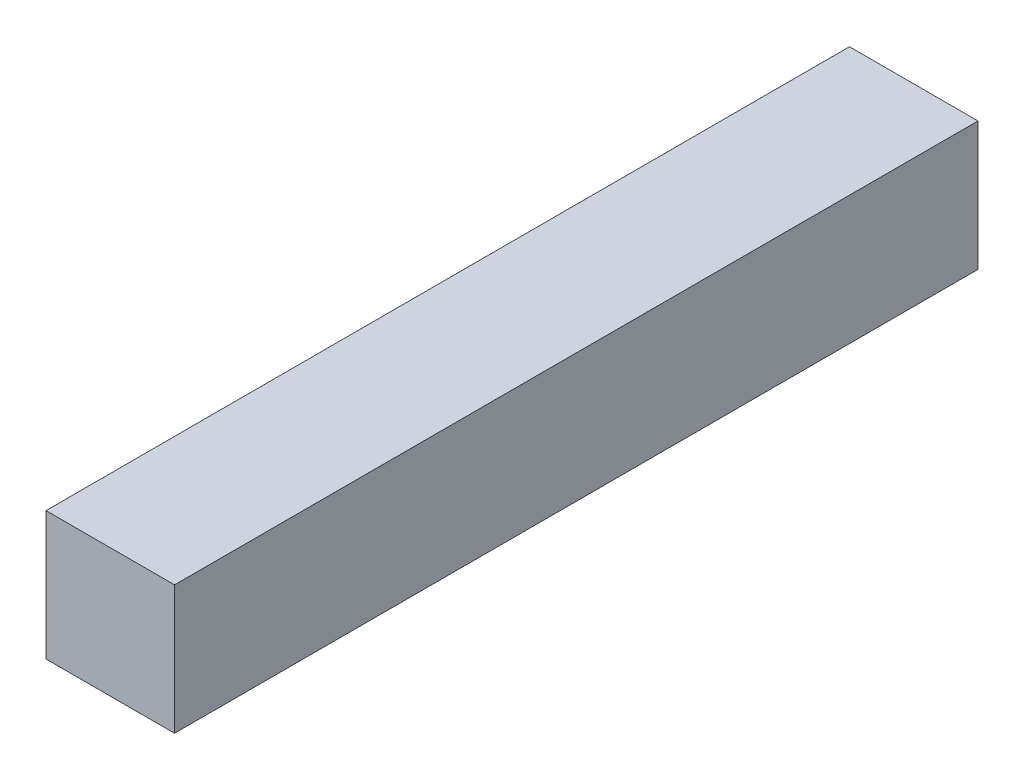
ISO-10303-21;
HEADER;
FILE_DESCRIPTION(('STEP AP214'),'2;1');
FILE_NAME('part.step','',(''),(''),'','','');
FILE_SCHEMA(('AUTOMOTIVE_DESIGN { 1 0 10303 214 1 1 1 1 }'));
ENDSEC;
DATA;
#1=APPLICATION_CONTEXT('core data for automotive mechanical design processes');
#2=APPLICATION_PROTOCOL_DEFINITION('international standard','automotive_design',2000,#1);
#3=PRODUCT_CONTEXT('',#1,'mechanical');
#4=PRODUCT('Part','Part','',(#3));
#5=PRODUCT_RELATED_PRODUCT_CATEGORY('part','',(#4));
#6=PRODUCT_DEFINITION_FORMATION('','',#4);
#7=PRODUCT_DEFINITION_CONTEXT('part definition',#1,'design');
#8=PRODUCT_DEFINITION('design','',#6,#7);
#9=PRODUCT_DEFINITION_SHAPE('','',#8);
#10=(LENGTH_UNIT() NAMED_UNIT(*) SI_UNIT(.MILLI.,.METRE.));
#11=(NAMED_UNIT(*) PLANE_ANGLE_UNIT() SI_UNIT($,.RADIAN.));
#12=(NAMED_UNIT(*) SI_UNIT($,.STERADIAN.) SOLID_ANGLE_UNIT());
#13=UNCERTAINTY_MEASURE_WITH_UNIT(LENGTH_MEASURE(1.E-05),#10,'distance_accuracy_value','');
#14=(GEOMETRIC_REPRESENTATION_CONTEXT(3) GLOBAL_UNCERTAINTY_ASSIGNED_CONTEXT((#13)) GLOBAL_UNIT_ASSIGNED_CONTEXT((#10,
#11,#12)) REPRESENTATION_CONTEXT('',''));
#15=CARTESIAN_POINT('',(0.,0.,0.));
#16=DIRECTION('',(0.,0.,1.));
#17=DIRECTION('',(1.,0.,0.));
#18=AXIS2_PLACEMENT_3D('',#15,#16,#17);
#19=CARTESIAN_POINT('',(-3.00120043547071,1.17046821977065,0.));
#20=DIRECTION('',(0.,1.,0.));
#21=DIRECTION('',(0.,0.,1.));
#22=AXIS2_PLACEMENT_3D('',#19,#20,#21);
#23=PLANE('',#22);
#24=DIRECTION('',(1.,0.,0.));
#25=VECTOR('',#24,1.);
#26=CARTESIAN_POINT('',(-2.7012004354707,1.17046821977065,0.));
#27=LINE('',#26,#25);
#28=CARTESIAN_POINT('',(-2.40120043547071,1.17046821977065,0.));
#29=VERTEX_POINT('',#28);
#30=CARTESIAN_POINT('',(-3.00120043547071,1.17046821977065,0.));
#31=VERTEX_POINT('',#30);
#32=EDGE_CURVE('E68',#29,#31,#27,.F.);
#33=ORIENTED_EDGE('',*,*,#32,.T.);
#34=DIRECTION('',(0.,0.,1.));
#35=VECTOR('',#34,1.);
#36=CARTESIAN_POINT('',(-3.00120043547071,1.17046821977065,0.));
#37=LINE('',#36,#35);
#38=CARTESIAN_POINT('',(-3.00120043547071,1.17046821977065,3.75));
#39=VERTEX_POINT('',#38);
#40=EDGE_CURVE('E55',#39,#31,#37,.F.);
#41=ORIENTED_EDGE('',*,*,#40,.F.);
#42=DIRECTION('',(1.,0.,0.));
#43=VECTOR('',#42,1.);
#44=CARTESIAN_POINT('',(-2.7012004354707,1.17046821977065,3.75));
#45=LINE('',#44,#43);
#46=CARTESIAN_POINT('',(-2.40120043547071,1.17046821977065,3.75));
#47=VERTEX_POINT('',#46);
#48=EDGE_CURVE('E20',#47,#39,#45,.F.);
#49=ORIENTED_EDGE('',*,*,#48,.F.);
#50=DIRECTION('',(0.,0.,-1.));
#51=VECTOR('',#50,1.);
#52=CARTESIAN_POINT('',(-2.40120043547071,1.17046821977065,0.));
#53=LINE('',#52,#51);
#54=EDGE_CURVE('E81',#29,#47,#53,.F.);
#55=ORIENTED_EDGE('',*,*,#54,.F.);
#56=EDGE_LOOP('',(#33,#41,#49,#55));
#57=FACE_BOUND('',#56,.T.);
#58=ADVANCED_FACE('F17',(#57),#23,.T.);
#59=CARTESIAN_POINT('',(-2.7012004354707,0.870468219770652,3.75));
#60=DIRECTION('',(0.,0.,1.));
#61=DIRECTION('',(1.,0.,0.));
#62=AXIS2_PLACEMENT_3D('',#59,#60,#61);
#63=PLANE('',#62);
#64=DIRECTION('',(0.,1.,0.));
#65=VECTOR('',#64,1.);
#66=CARTESIAN_POINT('',(-3.00120043547071,0.570468219770652,3.75));
#67=LINE('',#66,#65);
#68=CARTESIAN_POINT('',(-3.00120043547071,0.570468219770652,3.75));
#69=VERTEX_POINT('',#68);
#70=EDGE_CURVE('E61',#69,#39,#67,.T.);
#71=ORIENTED_EDGE('',*,*,#70,.F.);
#72=DIRECTION('',(1.,0.,0.));
#73=VECTOR('',#72,1.);
#74=CARTESIAN_POINT('',(-2.40120043547071,0.570468219770652,3.75));
#75=LINE('',#74,#73);
#76=CARTESIAN_POINT('',(-2.40120043547071,0.570468219770652,3.75));
#77=VERTEX_POINT('',#76);
#78=EDGE_CURVE('E83',#77,#69,#75,.F.);
#79=ORIENTED_EDGE('',*,*,#78,.F.);
#80=DIRECTION('',(0.,1.,0.));
#81=VECTOR('',#80,1.);
#82=CARTESIAN_POINT('',(-2.40120043547071,1.17046821977065,3.75));
#83=LINE('',#82,#81);
#84=EDGE_CURVE('E64',#47,#77,#83,.F.);
#85=ORIENTED_EDGE('',*,*,#84,.F.);
#86=ORIENTED_EDGE('',*,*,#48,.T.);
#87=EDGE_LOOP('',(#71,#79,#85,#86));
#88=FACE_BOUND('',#87,.T.);
#89=ADVANCED_FACE('F60',(#88),#63,.T.);
#90=CARTESIAN_POINT('',(-3.00120043547071,0.570468219770652,0.));
#91=DIRECTION('',(-1.,0.,0.));
#92=DIRECTION('',(0.,0.,1.));
#93=AXIS2_PLACEMENT_3D('',#90,#91,#92);
#94=PLANE('',#93);
#95=DIRECTION('',(0.,1.,0.));
#96=VECTOR('',#95,1.);
#97=CARTESIAN_POINT('',(-3.00120043547071,0.870468219770651,0.));
#98=LINE('',#97,#96);
#99=CARTESIAN_POINT('',(-3.00120043547071,0.570468219770652,0.));
#100=VERTEX_POINT('',#99);
#101=EDGE_CURVE('E70',#31,#100,#98,.F.);
#102=ORIENTED_EDGE('',*,*,#101,.T.);
#103=DIRECTION('',(0.,0.,-1.));
#104=VECTOR('',#103,1.);
#105=CARTESIAN_POINT('',(-3.00120043547071,0.570468219770652,0.));
#106=LINE('',#105,#104);
#107=EDGE_CURVE('E74',#69,#100,#106,.T.);
#108=ORIENTED_EDGE('',*,*,#107,.F.);
#109=ORIENTED_EDGE('',*,*,#70,.T.);
#110=ORIENTED_EDGE('',*,*,#40,.T.);
#111=EDGE_LOOP('',(#102,#108,#109,#110));
#112=FACE_BOUND('',#111,.T.);
#113=ADVANCED_FACE('F72',(#112),#94,.T.);
#114=CARTESIAN_POINT('',(-2.7012004354707,0.870468219770651,0.));
#115=DIRECTION('',(0.,0.,1.));
#116=DIRECTION('',(1.,0.,0.));
#117=AXIS2_PLACEMENT_3D('',#114,#115,#116);
#118=PLANE('',#117);
#119=DIRECTION('',(0.,1.,0.));
#120=VECTOR('',#119,1.);
#121=CARTESIAN_POINT('',(-2.40120043547071,1.17046821977065,0.));
#122=LINE('',#121,#120);
#123=CARTESIAN_POINT('',(-2.40120043547071,0.570468219770652,0.));
#124=VERTEX_POINT('',#123);
#125=EDGE_CURVE('E35',#124,#29,#122,.T.);
#126=ORIENTED_EDGE('',*,*,#125,.F.);
#127=DIRECTION('',(1.,0.,0.));
#128=VECTOR('',#127,1.);
#129=CARTESIAN_POINT('',(-2.40120043547071,0.570468219770652,0.));
#130=LINE('',#129,#128);
#131=EDGE_CURVE('E26',#100,#124,#130,.T.);
#132=ORIENTED_EDGE('',*,*,#131,.F.);
#133=ORIENTED_EDGE('',*,*,#101,.F.);
#134=ORIENTED_EDGE('',*,*,#32,.F.);
#135=EDGE_LOOP('',(#126,#132,#133,#134));
#136=FACE_BOUND('',#135,.T.);
#137=ADVANCED_FACE('F89',(#136),#118,.F.);
#138=CARTESIAN_POINT('',(-2.40120043547071,1.17046821977065,0.));
#139=DIRECTION('',(1.,0.,0.));
#140=DIRECTION('',(0.,0.,-1.));
#141=AXIS2_PLACEMENT_3D('',#138,#139,#140);
#142=PLANE('',#141);
#143=ORIENTED_EDGE('',*,*,#125,.T.);
#144=ORIENTED_EDGE('',*,*,#54,.T.);
#145=ORIENTED_EDGE('',*,*,#84,.T.);
#146=DIRECTION('',(0.,0.,-1.));
#147=VECTOR('',#146,1.);
#148=CARTESIAN_POINT('',(-2.40120043547071,0.570468219770652,0.));
#149=LINE('',#148,#147);
#150=EDGE_CURVE('E11',#124,#77,#149,.F.);
#151=ORIENTED_EDGE('',*,*,#150,.F.);
#152=EDGE_LOOP('',(#143,#144,#145,#151));
#153=FACE_BOUND('',#152,.T.);
#154=ADVANCED_FACE('F91',(#153),#142,.T.);
#155=CARTESIAN_POINT('',(-2.40120043547071,0.570468219770652,0.));
#156=DIRECTION('',(0.,-1.,0.));
#157=DIRECTION('',(0.,0.,-1.));
#158=AXIS2_PLACEMENT_3D('',#155,#156,#157);
#159=PLANE('',#158);
#160=ORIENTED_EDGE('',*,*,#131,.T.);
#161=ORIENTED_EDGE('',*,*,#150,.T.);
#162=ORIENTED_EDGE('',*,*,#78,.T.);
#163=ORIENTED_EDGE('',*,*,#107,.T.);
#164=EDGE_LOOP('',(#160,#161,#162,#163));
#165=FACE_BOUND('',#164,.T.);
#166=ADVANCED_FACE('F88',(#165),#159,.T.);
#167=CLOSED_SHELL('',(#58,#89,#113,#137,#154,#166));
#168=MANIFOLD_SOLID_BREP('B1',#167);
#169=ADVANCED_BREP_SHAPE_REPRESENTATION('',(#18,#168),#14);
#170=SHAPE_DEFINITION_REPRESENTATION(#9,#169);
ENDSEC;
END-ISO-10303-21;
